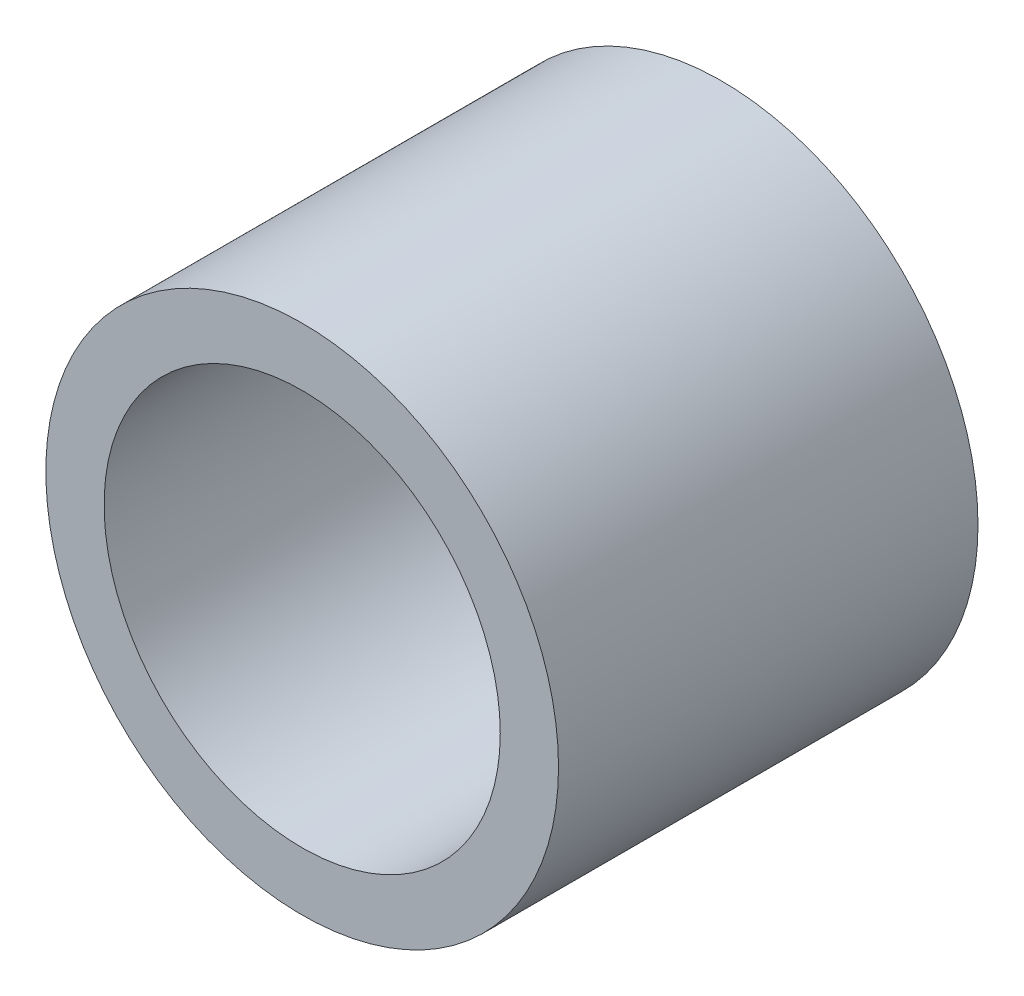
ISO-10303-21;
HEADER;
FILE_DESCRIPTION(('STEP AP214'),'2;1');
FILE_NAME('part.step','',(''),(''),'','','');
FILE_SCHEMA(('AUTOMOTIVE_DESIGN { 1 0 10303 214 1 1 1 1 }'));
ENDSEC;
DATA;
#1=APPLICATION_CONTEXT('core data for automotive mechanical design processes');
#2=APPLICATION_PROTOCOL_DEFINITION('international standard','automotive_design',2000,#1);
#3=PRODUCT_CONTEXT('',#1,'mechanical');
#4=PRODUCT('Part','Part','',(#3));
#5=PRODUCT_RELATED_PRODUCT_CATEGORY('part','',(#4));
#6=PRODUCT_DEFINITION_FORMATION('','',#4);
#7=PRODUCT_DEFINITION_CONTEXT('part definition',#1,'design');
#8=PRODUCT_DEFINITION('design','',#6,#7);
#9=PRODUCT_DEFINITION_SHAPE('','',#8);
#10=(LENGTH_UNIT() NAMED_UNIT(*) SI_UNIT(.MILLI.,.METRE.));
#11=(NAMED_UNIT(*) PLANE_ANGLE_UNIT() SI_UNIT($,.RADIAN.));
#12=(NAMED_UNIT(*) SI_UNIT($,.STERADIAN.) SOLID_ANGLE_UNIT());
#13=UNCERTAINTY_MEASURE_WITH_UNIT(LENGTH_MEASURE(1.E-05),#10,'distance_accuracy_value','');
#14=(GEOMETRIC_REPRESENTATION_CONTEXT(3) GLOBAL_UNCERTAINTY_ASSIGNED_CONTEXT((#13)) GLOBAL_UNIT_ASSIGNED_CONTEXT((#10,
#11,#12)) REPRESENTATION_CONTEXT('',''));
#15=CARTESIAN_POINT('',(0.,0.,0.));
#16=DIRECTION('',(0.,0.,1.));
#17=DIRECTION('',(1.,0.,0.));
#18=AXIS2_PLACEMENT_3D('',#15,#16,#17);
#19=CARTESIAN_POINT('',(0.,0.,9.));
#20=DIRECTION('',(0.,0.,1.));
#21=DIRECTION('',(1.,0.,0.));
#22=AXIS2_PLACEMENT_3D('',#19,#20,#21);
#23=PLANE('',#22);
#24=CARTESIAN_POINT('',(0.,0.,9.));
#25=DIRECTION('',(0.,0.,1.));
#26=DIRECTION('',(1.,0.,0.));
#27=AXIS2_PLACEMENT_3D('',#24,#25,#26);
#28=CIRCLE('',#27,5.5);
#29=CARTESIAN_POINT('',(5.5,0.,9.));
#30=VERTEX_POINT('',#29);
#31=EDGE_CURVE('E10',#30,#30,#28,.T.);
#32=ORIENTED_EDGE('',*,*,#31,.T.);
#33=EDGE_LOOP('',(#32));
#34=FACE_BOUND('',#33,.T.);
#35=CARTESIAN_POINT('',(0.,0.,9.));
#36=DIRECTION('',(0.,0.,1.));
#37=DIRECTION('',(1.,0.,0.));
#38=AXIS2_PLACEMENT_3D('',#35,#36,#37);
#39=CIRCLE('',#38,4.25);
#40=CARTESIAN_POINT('',(4.25,0.,9.));
#41=VERTEX_POINT('',#40);
#42=EDGE_CURVE('E41',#41,#41,#39,.T.);
#43=ORIENTED_EDGE('',*,*,#42,.F.);
#44=EDGE_LOOP('',(#43));
#45=FACE_BOUND('',#44,.T.);
#46=ADVANCED_FACE('F30',(#34,#45),#23,.T.);
#47=CARTESIAN_POINT('',(0.,0.,0.));
#48=DIRECTION('',(0.,0.,1.));
#49=DIRECTION('',(1.,0.,0.));
#50=AXIS2_PLACEMENT_3D('',#47,#48,#49);
#51=PLANE('',#50);
#52=CARTESIAN_POINT('',(0.,0.,0.));
#53=DIRECTION('',(0.,0.,1.));
#54=DIRECTION('',(1.,0.,0.));
#55=AXIS2_PLACEMENT_3D('',#52,#53,#54);
#56=CIRCLE('',#55,5.5);
#57=CARTESIAN_POINT('',(5.5,0.,0.));
#58=VERTEX_POINT('',#57);
#59=EDGE_CURVE('E34',#58,#58,#56,.T.);
#60=ORIENTED_EDGE('',*,*,#59,.F.);
#61=EDGE_LOOP('',(#60));
#62=FACE_BOUND('',#61,.T.);
#63=CARTESIAN_POINT('',(0.,0.,0.));
#64=DIRECTION('',(0.,0.,1.));
#65=DIRECTION('',(1.,0.,0.));
#66=AXIS2_PLACEMENT_3D('',#63,#64,#65);
#67=CIRCLE('',#66,4.25);
#68=CARTESIAN_POINT('',(4.25,0.,0.));
#69=VERTEX_POINT('',#68);
#70=EDGE_CURVE('E43',#69,#69,#67,.T.);
#71=ORIENTED_EDGE('',*,*,#70,.T.);
#72=EDGE_LOOP('',(#71));
#73=FACE_BOUND('',#72,.T.);
#74=ADVANCED_FACE('F53',(#62,#73),#51,.F.);
#75=CARTESIAN_POINT('',(0.,0.,9.));
#76=DIRECTION('',(0.,0.,-1.));
#77=DIRECTION('',(-1.,0.,0.));
#78=AXIS2_PLACEMENT_3D('',#75,#76,#77);
#79=CYLINDRICAL_SURFACE('',#78,5.5);
#80=ORIENTED_EDGE('',*,*,#31,.F.);
#81=EDGE_LOOP('',(#80));
#82=FACE_BOUND('',#81,.T.);
#83=ORIENTED_EDGE('',*,*,#59,.T.);
#84=EDGE_LOOP('',(#83));
#85=FACE_BOUND('',#84,.T.);
#86=ADVANCED_FACE('F32',(#82,#85),#79,.T.);
#87=CARTESIAN_POINT('',(0.,0.,9.));
#88=DIRECTION('',(0.,0.,-1.));
#89=DIRECTION('',(-1.,0.,0.));
#90=AXIS2_PLACEMENT_3D('',#87,#88,#89);
#91=CYLINDRICAL_SURFACE('',#90,4.25);
#92=ORIENTED_EDGE('',*,*,#42,.T.);
#93=EDGE_LOOP('',(#92));
#94=FACE_BOUND('',#93,.T.);
#95=ORIENTED_EDGE('',*,*,#70,.F.);
#96=EDGE_LOOP('',(#95));
#97=FACE_BOUND('',#96,.T.);
#98=ADVANCED_FACE('F49',(#94,#97),#91,.F.);
#99=CLOSED_SHELL('',(#46,#74,#86,#98));
#100=MANIFOLD_SOLID_BREP('B2',#99);
#101=ADVANCED_BREP_SHAPE_REPRESENTATION('',(#18,#100),#14);
#102=SHAPE_DEFINITION_REPRESENTATION(#9,#101);
ENDSEC;
END-ISO-10303-21;
